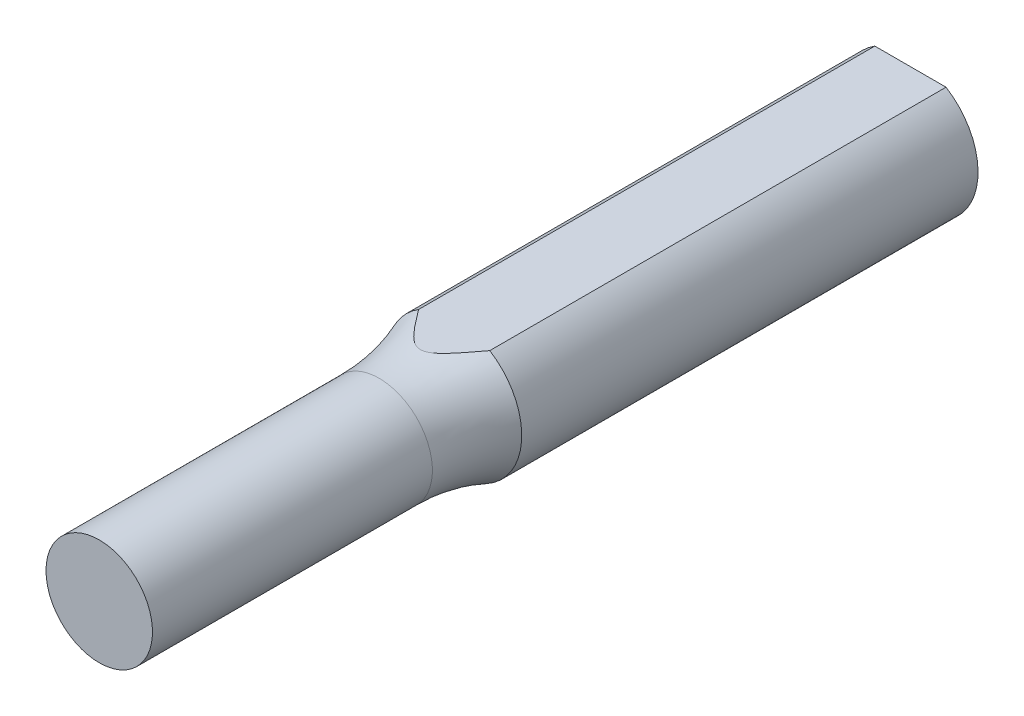
ISO-10303-21;
HEADER;
FILE_DESCRIPTION(('STEP AP214'),'2;1');
FILE_NAME('part.step','',(''),(''),'','','');
FILE_SCHEMA(('AUTOMOTIVE_DESIGN { 1 0 10303 214 1 1 1 1 }'));
ENDSEC;
DATA;
#1=APPLICATION_CONTEXT('core data for automotive mechanical design processes');
#2=APPLICATION_PROTOCOL_DEFINITION('international standard','automotive_design',2000,#1);
#3=PRODUCT_CONTEXT('',#1,'mechanical');
#4=PRODUCT('Part','Part','',(#3));
#5=PRODUCT_RELATED_PRODUCT_CATEGORY('part','',(#4));
#6=PRODUCT_DEFINITION_FORMATION('','',#4);
#7=PRODUCT_DEFINITION_CONTEXT('part definition',#1,'design');
#8=PRODUCT_DEFINITION('design','',#6,#7);
#9=PRODUCT_DEFINITION_SHAPE('','',#8);
#10=(LENGTH_UNIT() NAMED_UNIT(*) SI_UNIT(.MILLI.,.METRE.));
#11=(NAMED_UNIT(*) PLANE_ANGLE_UNIT() SI_UNIT($,.RADIAN.));
#12=(NAMED_UNIT(*) SI_UNIT($,.STERADIAN.) SOLID_ANGLE_UNIT());
#13=UNCERTAINTY_MEASURE_WITH_UNIT(LENGTH_MEASURE(1.E-05),#10,'distance_accuracy_value','');
#14=(GEOMETRIC_REPRESENTATION_CONTEXT(3) GLOBAL_UNCERTAINTY_ASSIGNED_CONTEXT((#13)) GLOBAL_UNIT_ASSIGNED_CONTEXT((#10,
#11,#12)) REPRESENTATION_CONTEXT('',''));
#15=CARTESIAN_POINT('',(0.,0.,0.));
#16=DIRECTION('',(0.,0.,1.));
#17=DIRECTION('',(1.,0.,0.));
#18=AXIS2_PLACEMENT_3D('',#15,#16,#17);
#19=CARTESIAN_POINT('',(2.10713075057055,-3.6,1.));
#20=DIRECTION('',(0.,-1.,0.));
#21=DIRECTION('',(0.,0.,-1.));
#22=AXIS2_PLACEMENT_3D('',#19,#20,#21);
#23=PLANE('',#22);
#24=DIRECTION('',(0.,0.,-1.));
#25=VECTOR('',#24,1.);
#26=CARTESIAN_POINT('',(2.10713075057055,-3.6,1.));
#27=LINE('',#26,#25);
#28=CARTESIAN_POINT('',(2.10713075057055,-3.6,16.));
#29=VERTEX_POINT('',#28);
#30=CARTESIAN_POINT('',(2.10713075057055,-3.6,-11.));
#31=VERTEX_POINT('',#30);
#32=EDGE_CURVE('E79',#29,#31,#27,.T.);
#33=ORIENTED_EDGE('',*,*,#32,.T.);
#34=DIRECTION('',(-1.,0.,0.));
#35=VECTOR('',#34,1.);
#36=CARTESIAN_POINT('',(2.10713075057055,-3.6,-11.));
#37=LINE('',#36,#35);
#38=CARTESIAN_POINT('',(-2.10713075057055,-3.6,-11.));
#39=VERTEX_POINT('',#38);
#40=EDGE_CURVE('E105',#31,#39,#37,.T.);
#41=ORIENTED_EDGE('',*,*,#40,.T.);
#42=DIRECTION('',(0.,0.,-1.));
#43=VECTOR('',#42,1.);
#44=CARTESIAN_POINT('',(-2.10713075057055,-3.6,1.));
#45=LINE('',#44,#43);
#46=CARTESIAN_POINT('',(-2.10713075057055,-3.6,16.));
#47=VERTEX_POINT('',#46);
#48=EDGE_CURVE('E81',#47,#39,#45,.T.);
#49=ORIENTED_EDGE('',*,*,#48,.F.);
#50=CARTESIAN_POINT('',(-2.10713075057055,-3.6,16.));
#51=CARTESIAN_POINT('',(-2.05156728657104,-3.6,16.0735504321284));
#52=CARTESIAN_POINT('',(-1.9960315309959,-3.6,16.1471223468733));
#53=CARTESIAN_POINT('',(-1.88476415065454,-3.6,16.2941318878611));
#54=CARTESIAN_POINT('',(-1.829032502786,-3.6,16.3675694965982));
#55=CARTESIAN_POINT('',(-1.71730402553263,-3.6,16.5138944118312));
#56=CARTESIAN_POINT('',(-1.66130850046733,-3.6,16.5867827095986));
#57=CARTESIAN_POINT('',(-1.54854856103125,-3.6,16.7319554391395));
#58=CARTESIAN_POINT('',(-1.49178419109368,-3.6,16.8042399054226));
#59=CARTESIAN_POINT('',(-1.36329890846602,-3.6,16.965027653545));
#60=CARTESIAN_POINT('',(-1.29124985868702,-3.6,17.0532721916395));
#61=CARTESIAN_POINT('',(-1.1437666728357,-3.6,17.2273623208635));
#62=CARTESIAN_POINT('',(-1.06832277533149,-3.6,17.3131996672464));
#63=CARTESIAN_POINT('',(-0.911332875790208,-3.6,17.4809519401346));
#64=CARTESIAN_POINT('',(-0.82973300722185,-3.6,17.5628185787615));
#65=CARTESIAN_POINT('',(-0.700609911001867,-3.6,17.677884251135));
#66=CARTESIAN_POINT('',(-0.656524865624807,-3.6,17.7148968968874));
#67=CARTESIAN_POINT('',(-0.565420510537114,-3.6,17.7850704197117));
#68=CARTESIAN_POINT('',(-0.518405512936776,-3.6,17.818236760898));
#69=CARTESIAN_POINT('',(-0.42869135781443,-3.6,17.8738115696618));
#70=CARTESIAN_POINT('',(-0.386543333736255,-3.6,17.8970923389929));
#71=CARTESIAN_POINT('',(-0.299483469624706,-3.6,17.9377957987884));
#72=CARTESIAN_POINT('',(-0.254575193542529,-3.6,17.9552258630291));
#73=CARTESIAN_POINT('',(-0.161599674036208,-3.6,17.9822864809545));
#74=CARTESIAN_POINT('',(-0.113494349047234,-3.6,17.9917923940196));
#75=CARTESIAN_POINT('',(-0.0163526260699509,-3.6,18.0007023847771));
#76=CARTESIAN_POINT('',(0.0326826351370068,-3.6,18.0001180905011));
#77=CARTESIAN_POINT('',(0.122137053650509,-3.6,17.9898776483084));
#78=CARTESIAN_POINT('',(0.162729384573968,-3.6,17.9816191385662));
#79=CARTESIAN_POINT('',(0.242186236777425,-3.6,17.9591240695692));
#80=CARTESIAN_POINT('',(0.281049781009095,-3.6,17.9448841761525));
#81=CARTESIAN_POINT('',(0.386670082698215,-3.6,17.8987516020519));
#82=CARTESIAN_POINT('',(0.451188513588853,-3.6,17.8618031202766));
#83=CARTESIAN_POINT('',(0.543641634788588,-3.6,17.8000554771747));
#84=CARTESIAN_POINT('',(0.573826273435401,-3.6,17.7783407293347));
#85=CARTESIAN_POINT('',(0.632936117194983,-3.6,17.7332623399425));
#86=CARTESIAN_POINT('',(0.661861885376931,-3.6,17.7098994480887));
#87=CARTESIAN_POINT('',(0.747359084255946,-3.6,17.6376622050089));
#88=CARTESIAN_POINT('',(0.802305577053361,-3.6,17.5868818591109));
#89=CARTESIAN_POINT('',(0.909162691781421,-3.6,17.4821991446101));
#90=CARTESIAN_POINT('',(0.961070653719825,-3.6,17.4282941203808));
#91=CARTESIAN_POINT('',(1.06282360256818,-3.6,17.318331517953));
#92=CARTESIAN_POINT('',(1.11266304629136,-3.6,17.2622688456226));
#93=CARTESIAN_POINT('',(1.21076912393644,-3.6,17.1487786559107));
#94=CARTESIAN_POINT('',(1.25903550712637,-3.6,17.0913509234489));
#95=CARTESIAN_POINT('',(1.40298480403525,-3.6,16.9167196173651));
#96=CARTESIAN_POINT('',(1.4969680074523,-3.6,16.79812193321));
#97=CARTESIAN_POINT('',(1.68267374231404,-3.6,16.559477973083));
#98=CARTESIAN_POINT('',(1.77439939073058,-3.6,16.4394340799866));
#99=CARTESIAN_POINT('',(1.95614187767935,-3.6,16.2000479889104));
#100=CARTESIAN_POINT('',(2.0461665367123,-3.6,16.0807117342369));
#101=CARTESIAN_POINT('',(2.2263572836042,-3.6,15.8421481910918));
#102=CARTESIAN_POINT('',(2.31652337109523,-3.6,15.7229209023379));
#103=CARTESIAN_POINT('',(2.58818485516806,-3.6,15.3661206367738));
#104=CARTESIAN_POINT('',(2.77084647667372,-3.6,15.1294252076886));
#105=CARTESIAN_POINT('',(3.14230115242146,-3.6,14.6611285039333));
#106=CARTESIAN_POINT('',(3.3310898145521,-3.6,14.4295237714296));
#107=CARTESIAN_POINT('',(3.71675064957369,-3.6,13.9730905509851));
#108=CARTESIAN_POINT('',(3.91362324291205,-3.6,13.7482624165543));
#109=CARTESIAN_POINT('',(4.31701467126365,-3.6,13.3065690627197));
#110=CARTESIAN_POINT('',(4.5235521051873,-3.6,13.0897207624602));
#111=CARTESIAN_POINT('',(4.94656518746152,-3.6,12.6659789008092));
#112=CARTESIAN_POINT('',(5.16303939423427,-3.6,12.4590839043052));
#113=CARTESIAN_POINT('',(5.60790335722646,-3.6,12.0551712646969));
#114=CARTESIAN_POINT('',(5.83636767740944,-3.6,11.8582354552508));
#115=CARTESIAN_POINT('',(6.30389481562263,-3.6,11.4770882975094));
#116=CARTESIAN_POINT('',(6.54296401207427,-3.6,11.2928847823415));
#117=CARTESIAN_POINT('',(6.78726102704399,-3.6,11.1157861047972));
#118=B_SPLINE_CURVE_WITH_KNOTS('',3,(#50,#51,#52,#53,#54,#55,#56,#57,#58,#59,#60,#61,#62,#63,
#64,#65,#66,#67,#68,#69,#70,#71,#72,#73,#74,#75,#76,#77,#78,#79,#80,#81,#82,#83,#84,#85,#86,#87,
#88,#89,#90,#91,#92,#93,#94,#95,#96,#97,#98,#99,#100,#101,#102,#103,#104,#105,#106,#107,#108,
#109,#110,#111,#112,#113,#114,#115,#116,#117),.UNSPECIFIED.,.F.,.F.,(4,2,2,2,2,2,2,2,2,2,2,2,2,
2,2,2,2,2,2,2,2,2,2,2,2,2,2,2,2,2,2,2,2,4),(0.,0.27653765308463,0.553109093646215,
0.828847506895406,1.10457005205081,1.44628160169595,1.7890478134787,2.13527082224691,
2.30782627203308,2.4801335038121,2.62426917904589,2.76822250870663,2.91439953026253,
3.06040810755962,3.18414103236296,3.30794302048401,3.52961956347286,3.64115878706686,
3.75264759746064,3.97688436378122,4.20131458291656,4.42631180003484,4.65134470605605,
5.10524021232631,5.55846920755133,6.00692035027717,6.4553703283163,7.35225515132349,
8.24851066596688,9.14481285428901,10.0429171515151,10.9408915654782,11.8453307859615,
12.7503215697008),.UNSPECIFIED.);
#119=EDGE_CURVE('E11',#47,#29,#118,.T.);
#120=ORIENTED_EDGE('',*,*,#119,.T.);
#121=EDGE_LOOP('',(#33,#41,#49,#120));
#122=FACE_BOUND('',#121,.T.);
#123=ADVANCED_FACE('F32',(#122),#23,.F.);
#124=CARTESIAN_POINT('',(0.,-7.,1.));
#125=DIRECTION('',(0.,0.,-1.));
#126=DIRECTION('',(-1.,0.,0.));
#127=AXIS2_PLACEMENT_3D('',#124,#125,#126);
#128=CYLINDRICAL_SURFACE('',#127,4.);
#129=ORIENTED_EDGE('',*,*,#48,.T.);
#130=CARTESIAN_POINT('',(0.,-7.,-11.));
#131=DIRECTION('',(0.,0.,1.));
#132=DIRECTION('',(1.,0.,0.));
#133=AXIS2_PLACEMENT_3D('',#130,#131,#132);
#134=CIRCLE('',#133,4.);
#135=EDGE_CURVE('E90',#39,#31,#134,.T.);
#136=ORIENTED_EDGE('',*,*,#135,.T.);
#137=ORIENTED_EDGE('',*,*,#32,.F.);
#138=CARTESIAN_POINT('',(0.,-7.,16.));
#139=DIRECTION('',(0.,0.,1.));
#140=DIRECTION('',(1.,0.,0.));
#141=AXIS2_PLACEMENT_3D('',#138,#139,#140);
#142=CIRCLE('',#141,4.);
#143=EDGE_CURVE('E88',#47,#29,#142,.T.);
#144=ORIENTED_EDGE('',*,*,#143,.F.);
#145=EDGE_LOOP('',(#129,#136,#137,#144));
#146=FACE_BOUND('',#145,.T.);
#147=ADVANCED_FACE('F87',(#146),#128,.T.);
#148=CARTESIAN_POINT('',(1.88148877222274,-4.35,1.));
#149=DIRECTION('',(0.,-1.,0.));
#150=DIRECTION('',(0.,0.,-1.));
#151=AXIS2_PLACEMENT_3D('',#148,#149,#150);
#152=PLANE('',#151);
#153=DIRECTION('',(0.,0.,-1.));
#154=VECTOR('',#153,1.);
#155=CARTESIAN_POINT('',(-1.88148877222274,-4.35,1.));
#156=LINE('',#155,#154);
#157=CARTESIAN_POINT('',(-1.88148877222273,-4.35000000000002,1.));
#158=VERTEX_POINT('',#157);
#159=CARTESIAN_POINT('',(-1.88148877222274,-4.35,-11.));
#160=VERTEX_POINT('',#159);
#161=EDGE_CURVE('E58',#158,#160,#156,.T.);
#162=ORIENTED_EDGE('',*,*,#161,.T.);
#163=DIRECTION('',(-1.,0.,0.));
#164=VECTOR('',#163,1.);
#165=CARTESIAN_POINT('',(1.88148877222274,-4.35,-11.));
#166=LINE('',#165,#164);
#167=CARTESIAN_POINT('',(1.88148877222274,-4.35,-11.));
#168=VERTEX_POINT('',#167);
#169=EDGE_CURVE('E97',#168,#160,#166,.T.);
#170=ORIENTED_EDGE('',*,*,#169,.F.);
#171=DIRECTION('',(0.,0.,-1.));
#172=VECTOR('',#171,1.);
#173=CARTESIAN_POINT('',(1.88148877222274,-4.35,1.));
#174=LINE('',#173,#172);
#175=CARTESIAN_POINT('',(1.88148877222274,-4.35,1.));
#176=VERTEX_POINT('',#175);
#177=EDGE_CURVE('E111',#176,#168,#174,.T.);
#178=ORIENTED_EDGE('',*,*,#177,.F.);
#179=DIRECTION('',(-1.,0.,0.));
#180=VECTOR('',#179,1.);
#181=CARTESIAN_POINT('',(1.88148877222274,-4.35,1.));
#182=LINE('',#181,#180);
#183=EDGE_CURVE('E108',#176,#158,#182,.T.);
#184=ORIENTED_EDGE('',*,*,#183,.T.);
#185=EDGE_LOOP('',(#162,#170,#178,#184));
#186=FACE_BOUND('',#185,.T.);
#187=ADVANCED_FACE('F129',(#186),#152,.T.);
#188=CARTESIAN_POINT('',(0.,-7.,1.));
#189=DIRECTION('',(0.,0.,-1.));
#190=DIRECTION('',(-1.,0.,0.));
#191=AXIS2_PLACEMENT_3D('',#188,#189,#190);
#192=CYLINDRICAL_SURFACE('',#191,3.25000000000002);
#193=ORIENTED_EDGE('',*,*,#177,.T.);
#194=CARTESIAN_POINT('',(0.,-7.,-11.));
#195=DIRECTION('',(0.,0.,1.));
#196=DIRECTION('',(1.,0.,0.));
#197=AXIS2_PLACEMENT_3D('',#194,#195,#196);
#198=CIRCLE('',#197,3.25000000000002);
#199=EDGE_CURVE('E93',#160,#168,#198,.T.);
#200=ORIENTED_EDGE('',*,*,#199,.F.);
#201=ORIENTED_EDGE('',*,*,#161,.F.);
#202=CARTESIAN_POINT('',(0.,-7.,1.));
#203=DIRECTION('',(0.,0.,1.));
#204=DIRECTION('',(1.,0.,0.));
#205=AXIS2_PLACEMENT_3D('',#202,#203,#204);
#206=CIRCLE('',#205,3.25000000000002);
#207=EDGE_CURVE('E51',#158,#176,#206,.T.);
#208=ORIENTED_EDGE('',*,*,#207,.T.);
#209=EDGE_LOOP('',(#193,#200,#201,#208));
#210=FACE_BOUND('',#209,.T.);
#211=ADVANCED_FACE('F135',(#210),#192,.F.);
#212=CARTESIAN_POINT('',(0.,-7.,-11.));
#213=DIRECTION('',(0.,0.,1.));
#214=DIRECTION('',(1.,0.,0.));
#215=AXIS2_PLACEMENT_3D('',#212,#213,#214);
#216=PLANE('',#215);
#217=ORIENTED_EDGE('',*,*,#169,.T.);
#218=ORIENTED_EDGE('',*,*,#199,.T.);
#219=EDGE_LOOP('',(#217,#218));
#220=FACE_BOUND('',#219,.T.);
#221=ORIENTED_EDGE('',*,*,#135,.F.);
#222=ORIENTED_EDGE('',*,*,#40,.F.);
#223=EDGE_LOOP('',(#221,#222));
#224=FACE_BOUND('',#223,.T.);
#225=ADVANCED_FACE('F138',(#220,#224),#216,.F.);
#226=CARTESIAN_POINT('',(0.,-7.,1.));
#227=DIRECTION('',(0.,0.,1.));
#228=DIRECTION('',(1.,0.,0.));
#229=AXIS2_PLACEMENT_3D('',#226,#227,#228);
#230=PLANE('',#229);
#231=ORIENTED_EDGE('',*,*,#207,.F.);
#232=ORIENTED_EDGE('',*,*,#183,.F.);
#233=EDGE_LOOP('',(#231,#232));
#234=FACE_BOUND('',#233,.T.);
#235=ADVANCED_FACE('F142',(#234),#230,.F.);
#236=CARTESIAN_POINT('',(0.,-7.,37.));
#237=DIRECTION('',(0.,0.,-1.));
#238=DIRECTION('',(-1.,0.,0.));
#239=AXIS2_PLACEMENT_3D('',#236,#237,#238);
#240=CYLINDRICAL_SURFACE('',#239,3.15);
#241=CARTESIAN_POINT('',(0.,-7.,20.4359328218538));
#242=DIRECTION('',(0.,0.,-1.));
#243=DIRECTION('',(-1.,0.,0.));
#244=AXIS2_PLACEMENT_3D('',#241,#242,#243);
#245=CIRCLE('',#244,3.15);
#246=CARTESIAN_POINT('',(-3.15,-7.,20.4359328218538));
#247=VERTEX_POINT('',#246);
#248=EDGE_CURVE('E45',#247,#247,#245,.F.);
#249=CARTESIAN_POINT('',(0.,-7.,37.));
#250=DIRECTION('',(0.,0.,1.));
#251=DIRECTION('',(1.,0.,0.));
#252=AXIS2_PLACEMENT_3D('',#249,#250,#251);
#253=CIRCLE('',#252,3.15);
#254=CARTESIAN_POINT('',(-3.15,-7.,37.));
#255=VERTEX_POINT('',#254);
#256=EDGE_CURVE('E94',#255,#255,#253,.T.);
#257=CARTESIAN_POINT('',(-3.15,-7.,20.4359328218538));
#258=CARTESIAN_POINT('',(-3.15,-7.,20.6084751882929));
#259=CARTESIAN_POINT('',(-3.15,-7.,20.7810175547319));
#260=CARTESIAN_POINT('',(-3.15,-7.,21.1261022876099));
#261=CARTESIAN_POINT('',(-3.15,-7.,21.2986446540489));
#262=CARTESIAN_POINT('',(-3.15,-7.,21.643729386927));
#263=CARTESIAN_POINT('',(-3.15,-7.,21.816271753366));
#264=CARTESIAN_POINT('',(-3.15,-7.,22.1613564862441));
#265=CARTESIAN_POINT('',(-3.15,-7.,22.3338988526831));
#266=CARTESIAN_POINT('',(-3.15,-7.,22.6789835855611));
#267=CARTESIAN_POINT('',(-3.15,-7.,22.8515259520001));
#268=CARTESIAN_POINT('',(-3.15,-7.,23.1966106848782));
#269=CARTESIAN_POINT('',(-3.15,-7.,23.3691530513172));
#270=CARTESIAN_POINT('',(-3.15,-7.,23.7142377841953));
#271=CARTESIAN_POINT('',(-3.15,-7.,23.8867801506343));
#272=CARTESIAN_POINT('',(-3.15,-7.,24.2318648835123));
#273=CARTESIAN_POINT('',(-3.15,-7.,24.4044072499513));
#274=CARTESIAN_POINT('',(-3.15,-7.,24.7494919828294));
#275=CARTESIAN_POINT('',(-3.15,-7.,24.9220343492684));
#276=CARTESIAN_POINT('',(-3.15,-7.,25.2671190821465));
#277=CARTESIAN_POINT('',(-3.15,-7.,25.4396614485855));
#278=CARTESIAN_POINT('',(-3.15,-7.,25.7847461814635));
#279=CARTESIAN_POINT('',(-3.15,-7.,25.9572885479026));
#280=CARTESIAN_POINT('',(-3.15,-7.,26.3023732807806));
#281=CARTESIAN_POINT('',(-3.15,-7.,26.4749156472196));
#282=CARTESIAN_POINT('',(-3.15,-7.,26.8200003800977));
#283=CARTESIAN_POINT('',(-3.15,-7.,26.9925427465367));
#284=CARTESIAN_POINT('',(-3.15,-7.,27.3376274794147));
#285=CARTESIAN_POINT('',(-3.15,-7.,27.5101698458538));
#286=CARTESIAN_POINT('',(-3.15,-7.,27.8552545787318));
#287=CARTESIAN_POINT('',(-3.15,-7.,28.0277969451708));
#288=CARTESIAN_POINT('',(-3.15,-7.,28.3728816780489));
#289=CARTESIAN_POINT('',(-3.15,-7.,28.5454240444879));
#290=CARTESIAN_POINT('',(-3.15,-7.,28.8905087773659));
#291=CARTESIAN_POINT('',(-3.15,-7.,29.063051143805));
#292=CARTESIAN_POINT('',(-3.15,-7.,29.408135876683));
#293=CARTESIAN_POINT('',(-3.15,-7.,29.580678243122));
#294=CARTESIAN_POINT('',(-3.15,-7.,29.9257629760001));
#295=CARTESIAN_POINT('',(-3.15,-7.,30.0983053424391));
#296=CARTESIAN_POINT('',(-3.15,-7.,30.4433900753171));
#297=CARTESIAN_POINT('',(-3.15,-7.,30.6159324417562));
#298=CARTESIAN_POINT('',(-3.15,-7.,30.9610171746342));
#299=CARTESIAN_POINT('',(-3.15,-7.,31.1335595410732));
#300=CARTESIAN_POINT('',(-3.15,-7.,31.4786442739513));
#301=CARTESIAN_POINT('',(-3.15,-7.,31.6511866403903));
#302=CARTESIAN_POINT('',(-3.15,-7.,31.9962713732683));
#303=CARTESIAN_POINT('',(-3.15,-7.,32.1688137397074));
#304=CARTESIAN_POINT('',(-3.15,-7.,32.5138984725854));
#305=CARTESIAN_POINT('',(-3.15,-7.,32.6864408390244));
#306=CARTESIAN_POINT('',(-3.15,-7.,33.0315255719025));
#307=CARTESIAN_POINT('',(-3.15,-7.,33.2040679383415));
#308=CARTESIAN_POINT('',(-3.15,-7.,33.5491526712196));
#309=CARTESIAN_POINT('',(-3.15,-7.,33.7216950376586));
#310=CARTESIAN_POINT('',(-3.15,-7.,34.0667797705366));
#311=CARTESIAN_POINT('',(-3.15,-7.,34.2393221369756));
#312=CARTESIAN_POINT('',(-3.15,-7.,34.5844068698537));
#313=CARTESIAN_POINT('',(-3.15,-7.,34.7569492362927));
#314=CARTESIAN_POINT('',(-3.15,-7.,35.1020339691708));
#315=CARTESIAN_POINT('',(-3.15,-7.,35.2745763356098));
#316=CARTESIAN_POINT('',(-3.15,-7.,35.6196610684878));
#317=CARTESIAN_POINT('',(-3.15,-7.,35.7922034349268));
#318=CARTESIAN_POINT('',(-3.15,-7.,36.1372881678049));
#319=CARTESIAN_POINT('',(-3.15,-7.,36.3098305342439));
#320=CARTESIAN_POINT('',(-3.15,-7.,36.654915267122));
#321=CARTESIAN_POINT('',(-3.15,-7.,36.827457633561));
#322=CARTESIAN_POINT('',(-3.15,-7.,37.));
#323=B_SPLINE_CURVE_WITH_KNOTS('',3,(#257,#258,#259,#260,#261,#262,#263,#264,#265,#266,#267,
#268,#269,#270,#271,#272,#273,#274,#275,#276,#277,#278,#279,#280,#281,#282,#283,#284,#285,#286,
#287,#288,#289,#290,#291,#292,#293,#294,#295,#296,#297,#298,#299,#300,#301,#302,#303,#304,#305,
#306,#307,#308,#309,#310,#311,#312,#313,#314,#315,#316,#317,#318,#319,#320,#321,#322),
.UNSPECIFIED.,.F.,.F.,(4,2,2,2,2,2,2,2,2,2,2,2,2,2,2,2,2,2,2,2,2,2,2,2,2,2,2,2,2,2,2,2,4),(0.,
0.517627099317068,1.03525419863413,1.5528812979512,2.07050839726827,2.58813549658534,
3.10576259590241,3.62338969521947,4.14101679453654,4.65864389385361,5.17627099317068,
5.69389809248775,6.21152519180481,6.72915229112188,7.24677939043895,7.76440648975602,
8.28203358907309,8.79966068839015,9.31728778770722,9.83491488702429,10.3525419863414,
10.8701690856584,11.3877961849755,11.9054232842926,12.4230503836096,12.9406774829267,
13.4583045822438,13.9759316815608,14.4935587808779,15.011185880195,15.528812979512,
16.0464400788291,16.5640671781462),.UNSPECIFIED.);
#324=EDGE_CURVE('BSEAM116',#247,#255,#323,.T.);
#325=ORIENTED_EDGE('',*,*,#248,.T.);
#326=ORIENTED_EDGE('',*,*,#256,.F.);
#327=ORIENTED_EDGE('',*,*,#324,.T.);
#328=ORIENTED_EDGE('',*,*,#324,.F.);
#329=EDGE_LOOP('',(#325,#327,#326,#328));
#330=FACE_BOUND('',#329,.T.);
#331=ADVANCED_FACE('F116',(#330),#240,.T.);
#332=CARTESIAN_POINT('',(0.,-7.,37.));
#333=DIRECTION('',(0.,0.,1.));
#334=DIRECTION('',(1.,0.,0.));
#335=AXIS2_PLACEMENT_3D('',#332,#333,#334);
#336=PLANE('',#335);
#337=ORIENTED_EDGE('',*,*,#256,.T.);
#338=EDGE_LOOP('',(#337));
#339=FACE_BOUND('',#338,.T.);
#340=ADVANCED_FACE('F119',(#339),#336,.T.);
#341=CARTESIAN_POINT('',(0.,-7.,20.4359328218538));
#342=DIRECTION('',(0.,0.,-1.));
#343=DIRECTION('',(-1.,0.,0.));
#344=AXIS2_PLACEMENT_3D('',#341,#342,#343);
#345=TOROIDAL_SURFACE('',#344,15.15,12.);
#346=ORIENTED_EDGE('',*,*,#119,.F.);
#347=ORIENTED_EDGE('',*,*,#143,.T.);
#348=EDGE_LOOP('',(#346,#347));
#349=FACE_BOUND('',#348,.T.);
#350=ORIENTED_EDGE('',*,*,#248,.F.);
#351=EDGE_LOOP('',(#350));
#352=FACE_BOUND('',#351,.T.);
#353=ADVANCED_FACE('F34',(#349,#352),#345,.F.);
#354=CLOSED_SHELL('',(#123,#147,#187,#211,#225,#235,#331,#340,#353));
#355=MANIFOLD_SOLID_BREP('B2',#354);
#356=ADVANCED_BREP_SHAPE_REPRESENTATION('',(#18,#355),#14);
#357=SHAPE_DEFINITION_REPRESENTATION(#9,#356);
ENDSEC;
END-ISO-10303-21;
